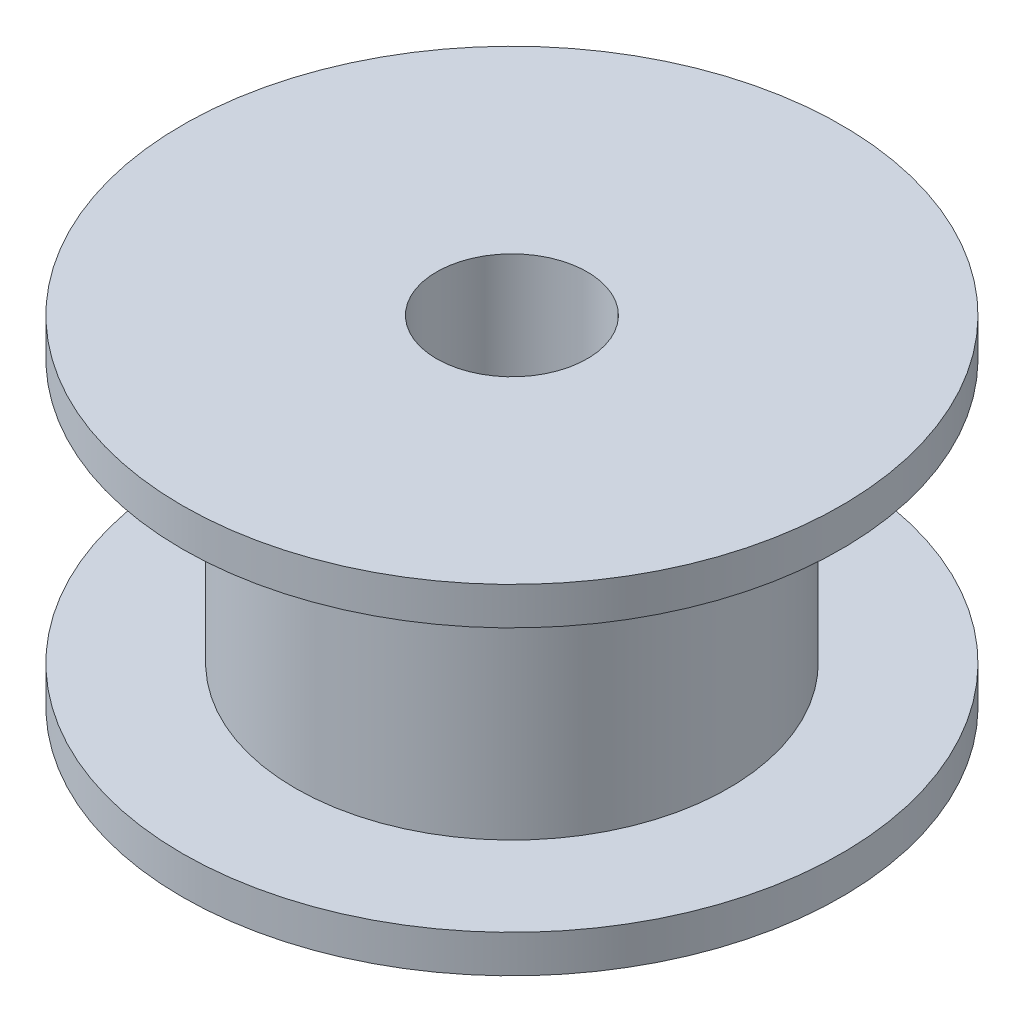
ISO-10303-21;
HEADER;
FILE_DESCRIPTION(('STEP AP214'),'2;1');
FILE_NAME('part.step','',(''),(''),'','','');
FILE_SCHEMA(('AUTOMOTIVE_DESIGN { 1 0 10303 214 1 1 1 1 }'));
ENDSEC;
DATA;
#1=APPLICATION_CONTEXT('core data for automotive mechanical design processes');
#2=APPLICATION_PROTOCOL_DEFINITION('international standard','automotive_design',2000,#1);
#3=PRODUCT_CONTEXT('',#1,'mechanical');
#4=PRODUCT('Part','Part','',(#3));
#5=PRODUCT_RELATED_PRODUCT_CATEGORY('part','',(#4));
#6=PRODUCT_DEFINITION_FORMATION('','',#4);
#7=PRODUCT_DEFINITION_CONTEXT('part definition',#1,'design');
#8=PRODUCT_DEFINITION('design','',#6,#7);
#9=PRODUCT_DEFINITION_SHAPE('','',#8);
#10=(LENGTH_UNIT() NAMED_UNIT(*) SI_UNIT(.MILLI.,.METRE.));
#11=(NAMED_UNIT(*) PLANE_ANGLE_UNIT() SI_UNIT($,.RADIAN.));
#12=(NAMED_UNIT(*) SI_UNIT($,.STERADIAN.) SOLID_ANGLE_UNIT());
#13=UNCERTAINTY_MEASURE_WITH_UNIT(LENGTH_MEASURE(1.E-05),#10,'distance_accuracy_value','');
#14=(GEOMETRIC_REPRESENTATION_CONTEXT(3) GLOBAL_UNCERTAINTY_ASSIGNED_CONTEXT((#13)) GLOBAL_UNIT_ASSIGNED_CONTEXT((#10,
#11,#12)) REPRESENTATION_CONTEXT('',''));
#15=CARTESIAN_POINT('',(0.,0.,0.));
#16=DIRECTION('',(0.,0.,1.));
#17=DIRECTION('',(1.,0.,0.));
#18=AXIS2_PLACEMENT_3D('',#15,#16,#17);
#19=CARTESIAN_POINT('',(0.,0.,0.));
#20=DIRECTION('',(0.,1.,0.));
#21=DIRECTION('',(0.,0.,1.));
#22=AXIS2_PLACEMENT_3D('',#19,#20,#21);
#23=CYLINDRICAL_SURFACE('',#22,2.);
#24=CARTESIAN_POINT('',(0.,-9.,0.));
#25=DIRECTION('',(0.,1.,0.));
#26=DIRECTION('',(0.,0.,1.));
#27=AXIS2_PLACEMENT_3D('',#24,#25,#26);
#28=CIRCLE('',#27,2.);
#29=CARTESIAN_POINT('',(0.,-9.,2.));
#30=VERTEX_POINT('',#29);
#31=EDGE_CURVE('E67',#30,#30,#28,.T.);
#32=ORIENTED_EDGE('',*,*,#31,.F.);
#33=EDGE_LOOP('',(#32));
#34=FACE_BOUND('',#33,.T.);
#35=CARTESIAN_POINT('',(0.,0.,0.));
#36=DIRECTION('',(0.,1.,0.));
#37=DIRECTION('',(0.,0.,1.));
#38=AXIS2_PLACEMENT_3D('',#35,#36,#37);
#39=CIRCLE('',#38,2.);
#40=CARTESIAN_POINT('',(0.,0.,2.));
#41=VERTEX_POINT('',#40);
#42=EDGE_CURVE('E10',#41,#41,#39,.T.);
#43=ORIENTED_EDGE('',*,*,#42,.T.);
#44=EDGE_LOOP('',(#43));
#45=FACE_BOUND('',#44,.T.);
#46=ADVANCED_FACE('F39',(#34,#45),#23,.F.);
#47=CARTESIAN_POINT('',(2.,0.,0.));
#48=DIRECTION('',(0.,-1.,0.));
#49=DIRECTION('',(0.,0.,-1.));
#50=AXIS2_PLACEMENT_3D('',#47,#48,#49);
#51=PLANE('',#50);
#52=ORIENTED_EDGE('',*,*,#42,.F.);
#53=EDGE_LOOP('',(#52));
#54=FACE_BOUND('',#53,.T.);
#55=CARTESIAN_POINT('',(0.,0.,0.));
#56=DIRECTION('',(0.,1.,0.));
#57=DIRECTION('',(0.,0.,1.));
#58=AXIS2_PLACEMENT_3D('',#55,#56,#57);
#59=CIRCLE('',#58,8.75);
#60=CARTESIAN_POINT('',(0.,0.,8.75));
#61=VERTEX_POINT('',#60);
#62=EDGE_CURVE('E45',#61,#61,#59,.T.);
#63=ORIENTED_EDGE('',*,*,#62,.T.);
#64=EDGE_LOOP('',(#63));
#65=FACE_BOUND('',#64,.T.);
#66=ADVANCED_FACE('F74',(#54,#65),#51,.F.);
#67=CARTESIAN_POINT('',(0.,0.,0.));
#68=DIRECTION('',(0.,1.,0.));
#69=DIRECTION('',(0.,0.,1.));
#70=AXIS2_PLACEMENT_3D('',#67,#68,#69);
#71=CYLINDRICAL_SURFACE('',#70,8.75);
#72=ORIENTED_EDGE('',*,*,#62,.F.);
#73=EDGE_LOOP('',(#72));
#74=FACE_BOUND('',#73,.T.);
#75=CARTESIAN_POINT('',(0.,-1.,0.));
#76=DIRECTION('',(0.,1.,0.));
#77=DIRECTION('',(0.,0.,1.));
#78=AXIS2_PLACEMENT_3D('',#75,#76,#77);
#79=CIRCLE('',#78,8.75);
#80=CARTESIAN_POINT('',(0.,-1.,8.75));
#81=VERTEX_POINT('',#80);
#82=EDGE_CURVE('E49',#81,#81,#79,.T.);
#83=ORIENTED_EDGE('',*,*,#82,.T.);
#84=EDGE_LOOP('',(#83));
#85=FACE_BOUND('',#84,.T.);
#86=ADVANCED_FACE('F78',(#74,#85),#71,.T.);
#87=CARTESIAN_POINT('',(8.75,-1.,0.));
#88=DIRECTION('',(0.,1.,0.));
#89=DIRECTION('',(0.,0.,1.));
#90=AXIS2_PLACEMENT_3D('',#87,#88,#89);
#91=PLANE('',#90);
#92=ORIENTED_EDGE('',*,*,#82,.F.);
#93=EDGE_LOOP('',(#92));
#94=FACE_BOUND('',#93,.T.);
#95=CARTESIAN_POINT('',(0.,-1.,0.));
#96=DIRECTION('',(0.,1.,0.));
#97=DIRECTION('',(0.,0.,1.));
#98=AXIS2_PLACEMENT_3D('',#95,#96,#97);
#99=CIRCLE('',#98,5.75);
#100=CARTESIAN_POINT('',(0.,-1.,5.75));
#101=VERTEX_POINT('',#100);
#102=EDGE_CURVE('E53',#101,#101,#99,.T.);
#103=ORIENTED_EDGE('',*,*,#102,.T.);
#104=EDGE_LOOP('',(#103));
#105=FACE_BOUND('',#104,.T.);
#106=ADVANCED_FACE('F83',(#94,#105),#91,.F.);
#107=CARTESIAN_POINT('',(0.,0.,0.));
#108=DIRECTION('',(0.,1.,0.));
#109=DIRECTION('',(0.,0.,1.));
#110=AXIS2_PLACEMENT_3D('',#107,#108,#109);
#111=CYLINDRICAL_SURFACE('',#110,5.75);
#112=ORIENTED_EDGE('',*,*,#102,.F.);
#113=EDGE_LOOP('',(#112));
#114=FACE_BOUND('',#113,.T.);
#115=CARTESIAN_POINT('',(0.,-8.,0.));
#116=DIRECTION('',(0.,1.,0.));
#117=DIRECTION('',(0.,0.,1.));
#118=AXIS2_PLACEMENT_3D('',#115,#116,#117);
#119=CIRCLE('',#118,5.75);
#120=CARTESIAN_POINT('',(0.,-8.,5.75));
#121=VERTEX_POINT('',#120);
#122=EDGE_CURVE('E58',#121,#121,#119,.T.);
#123=ORIENTED_EDGE('',*,*,#122,.T.);
#124=EDGE_LOOP('',(#123));
#125=FACE_BOUND('',#124,.T.);
#126=ADVANCED_FACE('F89',(#114,#125),#111,.T.);
#127=CARTESIAN_POINT('',(5.75,-8.,0.));
#128=DIRECTION('',(0.,-1.,0.));
#129=DIRECTION('',(0.,0.,-1.));
#130=AXIS2_PLACEMENT_3D('',#127,#128,#129);
#131=PLANE('',#130);
#132=ORIENTED_EDGE('',*,*,#122,.F.);
#133=EDGE_LOOP('',(#132));
#134=FACE_BOUND('',#133,.T.);
#135=CARTESIAN_POINT('',(0.,-8.,0.));
#136=DIRECTION('',(0.,1.,0.));
#137=DIRECTION('',(0.,0.,1.));
#138=AXIS2_PLACEMENT_3D('',#135,#136,#137);
#139=CIRCLE('',#138,8.75);
#140=CARTESIAN_POINT('',(0.,-8.,8.75));
#141=VERTEX_POINT('',#140);
#142=EDGE_CURVE('E61',#141,#141,#139,.T.);
#143=ORIENTED_EDGE('',*,*,#142,.T.);
#144=EDGE_LOOP('',(#143));
#145=FACE_BOUND('',#144,.T.);
#146=ADVANCED_FACE('F93',(#134,#145),#131,.F.);
#147=CARTESIAN_POINT('',(0.,0.,0.));
#148=DIRECTION('',(0.,1.,0.));
#149=DIRECTION('',(0.,0.,1.));
#150=AXIS2_PLACEMENT_3D('',#147,#148,#149);
#151=CYLINDRICAL_SURFACE('',#150,8.75);
#152=ORIENTED_EDGE('',*,*,#142,.F.);
#153=EDGE_LOOP('',(#152));
#154=FACE_BOUND('',#153,.T.);
#155=CARTESIAN_POINT('',(0.,-9.,0.));
#156=DIRECTION('',(0.,1.,0.));
#157=DIRECTION('',(0.,0.,1.));
#158=AXIS2_PLACEMENT_3D('',#155,#156,#157);
#159=CIRCLE('',#158,8.75);
#160=CARTESIAN_POINT('',(0.,-9.,8.75));
#161=VERTEX_POINT('',#160);
#162=EDGE_CURVE('E64',#161,#161,#159,.T.);
#163=ORIENTED_EDGE('',*,*,#162,.T.);
#164=EDGE_LOOP('',(#163));
#165=FACE_BOUND('',#164,.T.);
#166=ADVANCED_FACE('F97',(#154,#165),#151,.T.);
#167=CARTESIAN_POINT('',(8.75,-9.,0.));
#168=DIRECTION('',(0.,1.,0.));
#169=DIRECTION('',(0.,0.,1.));
#170=AXIS2_PLACEMENT_3D('',#167,#168,#169);
#171=PLANE('',#170);
#172=ORIENTED_EDGE('',*,*,#162,.F.);
#173=EDGE_LOOP('',(#172));
#174=FACE_BOUND('',#173,.T.);
#175=ORIENTED_EDGE('',*,*,#31,.T.);
#176=EDGE_LOOP('',(#175));
#177=FACE_BOUND('',#176,.T.);
#178=ADVANCED_FACE('F71',(#174,#177),#171,.F.);
#179=CLOSED_SHELL('',(#46,#66,#86,#106,#126,#146,#166,#178));
#180=MANIFOLD_SOLID_BREP('B2',#179);
#181=ADVANCED_BREP_SHAPE_REPRESENTATION('',(#18,#180),#14);
#182=SHAPE_DEFINITION_REPRESENTATION(#9,#181);
ENDSEC;
END-ISO-10303-21;
